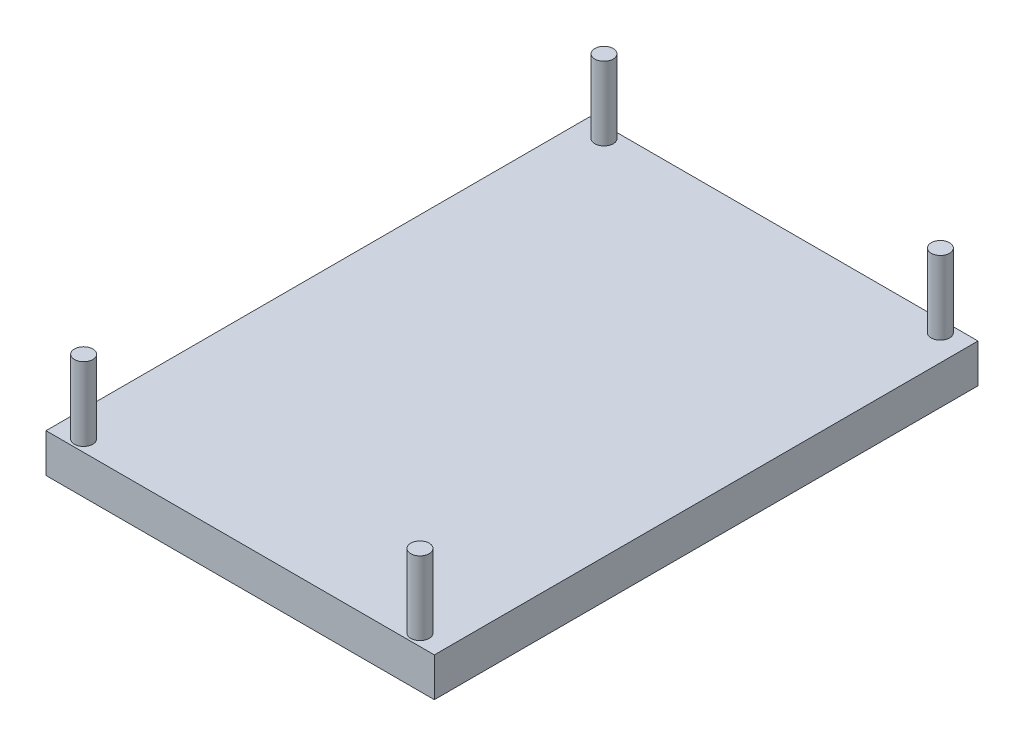
ISO-10303-21;
HEADER;
FILE_DESCRIPTION(('STEP AP214'),'2;1');
FILE_NAME('part.step','',(''),(''),'','','');
FILE_SCHEMA(('AUTOMOTIVE_DESIGN { 1 0 10303 214 1 1 1 1 }'));
ENDSEC;
DATA;
#1=APPLICATION_CONTEXT('core data for automotive mechanical design processes');
#2=APPLICATION_PROTOCOL_DEFINITION('international standard','automotive_design',2000,#1);
#3=PRODUCT_CONTEXT('',#1,'mechanical');
#4=PRODUCT('Part','Part','',(#3));
#5=PRODUCT_RELATED_PRODUCT_CATEGORY('part','',(#4));
#6=PRODUCT_DEFINITION_FORMATION('','',#4);
#7=PRODUCT_DEFINITION_CONTEXT('part definition',#1,'design');
#8=PRODUCT_DEFINITION('design','',#6,#7);
#9=PRODUCT_DEFINITION_SHAPE('','',#8);
#10=(LENGTH_UNIT() NAMED_UNIT(*) SI_UNIT(.MILLI.,.METRE.));
#11=(NAMED_UNIT(*) PLANE_ANGLE_UNIT() SI_UNIT($,.RADIAN.));
#12=(NAMED_UNIT(*) SI_UNIT($,.STERADIAN.) SOLID_ANGLE_UNIT());
#13=UNCERTAINTY_MEASURE_WITH_UNIT(LENGTH_MEASURE(1.E-05),#10,'distance_accuracy_value','');
#14=(GEOMETRIC_REPRESENTATION_CONTEXT(3) GLOBAL_UNCERTAINTY_ASSIGNED_CONTEXT((#13)) GLOBAL_UNIT_ASSIGNED_CONTEXT((#10,
#11,#12)) REPRESENTATION_CONTEXT('',''));
#15=CARTESIAN_POINT('',(0.,0.,0.));
#16=DIRECTION('',(0.,0.,1.));
#17=DIRECTION('',(1.,0.,0.));
#18=AXIS2_PLACEMENT_3D('',#15,#16,#17);
#19=CARTESIAN_POINT('',(31.75,6.35,44.45));
#20=DIRECTION('',(-1.,0.,0.));
#21=DIRECTION('',(0.,0.,1.));
#22=AXIS2_PLACEMENT_3D('',#19,#20,#21);
#23=PLANE('',#22);
#24=DIRECTION('',(0.,0.,-1.));
#25=VECTOR('',#24,1.);
#26=CARTESIAN_POINT('',(31.75,0.,44.45));
#27=LINE('',#26,#25);
#28=CARTESIAN_POINT('',(31.75,0.,44.45));
#29=VERTEX_POINT('',#28);
#30=CARTESIAN_POINT('',(31.75,0.,-44.45));
#31=VERTEX_POINT('',#30);
#32=EDGE_CURVE('E120',#29,#31,#27,.T.);
#33=ORIENTED_EDGE('',*,*,#32,.T.);
#34=DIRECTION('',(0.,-1.,0.));
#35=VECTOR('',#34,1.);
#36=CARTESIAN_POINT('',(31.75,6.35,-44.45));
#37=LINE('',#36,#35);
#38=CARTESIAN_POINT('',(31.75,6.35,-44.45));
#39=VERTEX_POINT('',#38);
#40=EDGE_CURVE('E48',#39,#31,#37,.T.);
#41=ORIENTED_EDGE('',*,*,#40,.F.);
#42=DIRECTION('',(0.,0.,-1.));
#43=VECTOR('',#42,1.);
#44=CARTESIAN_POINT('',(31.75,6.35,44.45));
#45=LINE('',#44,#43);
#46=CARTESIAN_POINT('',(31.75,6.35,44.45));
#47=VERTEX_POINT('',#46);
#48=EDGE_CURVE('E99',#47,#39,#45,.T.);
#49=ORIENTED_EDGE('',*,*,#48,.F.);
#50=DIRECTION('',(0.,-1.,0.));
#51=VECTOR('',#50,1.);
#52=CARTESIAN_POINT('',(31.75,6.35,44.45));
#53=LINE('',#52,#51);
#54=EDGE_CURVE('E114',#47,#29,#53,.T.);
#55=ORIENTED_EDGE('',*,*,#54,.T.);
#56=EDGE_LOOP('',(#33,#41,#49,#55));
#57=FACE_BOUND('',#56,.T.);
#58=ADVANCED_FACE('F44',(#57),#23,.F.);
#59=CARTESIAN_POINT('',(-31.75,6.35,-44.45));
#60=DIRECTION('',(0.,0.,1.));
#61=DIRECTION('',(1.,0.,0.));
#62=AXIS2_PLACEMENT_3D('',#59,#60,#61);
#63=PLANE('',#62);
#64=DIRECTION('',(-1.,0.,0.));
#65=VECTOR('',#64,1.);
#66=CARTESIAN_POINT('',(-31.75,0.,-44.45));
#67=LINE('',#66,#65);
#68=CARTESIAN_POINT('',(-31.75,0.,-44.45));
#69=VERTEX_POINT('',#68);
#70=EDGE_CURVE('E106',#31,#69,#67,.T.);
#71=ORIENTED_EDGE('',*,*,#70,.T.);
#72=DIRECTION('',(0.,-1.,0.));
#73=VECTOR('',#72,1.);
#74=CARTESIAN_POINT('',(-31.75,6.35,-44.45));
#75=LINE('',#74,#73);
#76=CARTESIAN_POINT('',(-31.75,6.35,-44.45));
#77=VERTEX_POINT('',#76);
#78=EDGE_CURVE('E102',#77,#69,#75,.T.);
#79=ORIENTED_EDGE('',*,*,#78,.F.);
#80=DIRECTION('',(-1.,0.,0.));
#81=VECTOR('',#80,1.);
#82=CARTESIAN_POINT('',(-31.75,6.35,-44.45));
#83=LINE('',#82,#81);
#84=EDGE_CURVE('E92',#39,#77,#83,.T.);
#85=ORIENTED_EDGE('',*,*,#84,.F.);
#86=ORIENTED_EDGE('',*,*,#40,.T.);
#87=EDGE_LOOP('',(#71,#79,#85,#86));
#88=FACE_BOUND('',#87,.T.);
#89=ADVANCED_FACE('F104',(#88),#63,.F.);
#90=CARTESIAN_POINT('',(-31.75,6.35,44.45));
#91=DIRECTION('',(1.,0.,0.));
#92=DIRECTION('',(0.,0.,-1.));
#93=AXIS2_PLACEMENT_3D('',#90,#91,#92);
#94=PLANE('',#93);
#95=DIRECTION('',(0.,0.,1.));
#96=VECTOR('',#95,1.);
#97=CARTESIAN_POINT('',(-31.75,0.,44.45));
#98=LINE('',#97,#96);
#99=CARTESIAN_POINT('',(-31.75,0.,44.45));
#100=VERTEX_POINT('',#99);
#101=EDGE_CURVE('E83',#69,#100,#98,.T.);
#102=ORIENTED_EDGE('',*,*,#101,.T.);
#103=DIRECTION('',(0.,-1.,0.));
#104=VECTOR('',#103,1.);
#105=CARTESIAN_POINT('',(-31.75,6.35,44.45));
#106=LINE('',#105,#104);
#107=CARTESIAN_POINT('',(-31.75,6.35,44.45));
#108=VERTEX_POINT('',#107);
#109=EDGE_CURVE('E107',#108,#100,#106,.T.);
#110=ORIENTED_EDGE('',*,*,#109,.F.);
#111=DIRECTION('',(0.,0.,1.));
#112=VECTOR('',#111,1.);
#113=CARTESIAN_POINT('',(-31.75,6.35,44.45));
#114=LINE('',#113,#112);
#115=EDGE_CURVE('E98',#77,#108,#114,.T.);
#116=ORIENTED_EDGE('',*,*,#115,.F.);
#117=ORIENTED_EDGE('',*,*,#78,.T.);
#118=EDGE_LOOP('',(#102,#110,#116,#117));
#119=FACE_BOUND('',#118,.T.);
#120=ADVANCED_FACE('F108',(#119),#94,.F.);
#121=CARTESIAN_POINT('',(-31.75,6.35,44.45));
#122=DIRECTION('',(0.,0.,-1.));
#123=DIRECTION('',(-1.,0.,0.));
#124=AXIS2_PLACEMENT_3D('',#121,#122,#123);
#125=PLANE('',#124);
#126=DIRECTION('',(1.,0.,0.));
#127=VECTOR('',#126,1.);
#128=CARTESIAN_POINT('',(-31.75,0.,44.45));
#129=LINE('',#128,#127);
#130=EDGE_CURVE('E87',#100,#29,#129,.T.);
#131=ORIENTED_EDGE('',*,*,#130,.T.);
#132=ORIENTED_EDGE('',*,*,#54,.F.);
#133=DIRECTION('',(1.,0.,0.));
#134=VECTOR('',#133,1.);
#135=CARTESIAN_POINT('',(-31.75,6.35,44.45));
#136=LINE('',#135,#134);
#137=EDGE_CURVE('E61',#108,#47,#136,.T.);
#138=ORIENTED_EDGE('',*,*,#137,.F.);
#139=ORIENTED_EDGE('',*,*,#109,.T.);
#140=EDGE_LOOP('',(#131,#132,#138,#139));
#141=FACE_BOUND('',#140,.T.);
#142=ADVANCED_FACE('F132',(#141),#125,.F.);
#143=CARTESIAN_POINT('',(0.,6.35,0.));
#144=DIRECTION('',(0.,-1.,0.));
#145=DIRECTION('',(0.,0.,-1.));
#146=AXIS2_PLACEMENT_3D('',#143,#144,#145);
#147=PLANE('',#146);
#148=CARTESIAN_POINT('',(-27.5,6.35,42.5476668383201));
#149=DIRECTION('',(0.,1.,0.));
#150=DIRECTION('',(0.,0.,1.));
#151=AXIS2_PLACEMENT_3D('',#148,#149,#150);
#152=CIRCLE('',#151,1.5);
#153=CARTESIAN_POINT('',(-27.5,6.35,44.0476668383201));
#154=VERTEX_POINT('',#153);
#155=EDGE_CURVE('E11',#154,#154,#152,.T.);
#156=ORIENTED_EDGE('',*,*,#155,.F.);
#157=EDGE_LOOP('',(#156));
#158=FACE_BOUND('',#157,.T.);
#159=CARTESIAN_POINT('',(27.5,6.35,42.5476668383201));
#160=DIRECTION('',(0.,1.,0.));
#161=DIRECTION('',(0.,0.,1.));
#162=AXIS2_PLACEMENT_3D('',#159,#160,#161);
#163=CIRCLE('',#162,1.5);
#164=CARTESIAN_POINT('',(27.5,6.35,44.0476668383201));
#165=VERTEX_POINT('',#164);
#166=EDGE_CURVE('E54',#165,#165,#163,.T.);
#167=ORIENTED_EDGE('',*,*,#166,.F.);
#168=EDGE_LOOP('',(#167));
#169=FACE_BOUND('',#168,.T.);
#170=CARTESIAN_POINT('',(27.5,6.35,-42.5476668383201));
#171=DIRECTION('',(0.,1.,0.));
#172=DIRECTION('',(0.,0.,1.));
#173=AXIS2_PLACEMENT_3D('',#170,#171,#172);
#174=CIRCLE('',#173,1.5);
#175=CARTESIAN_POINT('',(27.5,6.35,-41.0476668383201));
#176=VERTEX_POINT('',#175);
#177=EDGE_CURVE('E142',#176,#176,#174,.T.);
#178=ORIENTED_EDGE('',*,*,#177,.F.);
#179=EDGE_LOOP('',(#178));
#180=FACE_BOUND('',#179,.T.);
#181=CARTESIAN_POINT('',(-27.5,6.35,-42.5476668383201));
#182=DIRECTION('',(0.,1.,0.));
#183=DIRECTION('',(0.,0.,1.));
#184=AXIS2_PLACEMENT_3D('',#181,#182,#183);
#185=CIRCLE('',#184,1.5);
#186=CARTESIAN_POINT('',(-27.5,6.35,-41.0476668383201));
#187=VERTEX_POINT('',#186);
#188=EDGE_CURVE('E137',#187,#187,#185,.T.);
#189=ORIENTED_EDGE('',*,*,#188,.F.);
#190=EDGE_LOOP('',(#189));
#191=FACE_BOUND('',#190,.T.);
#192=ORIENTED_EDGE('',*,*,#48,.T.);
#193=ORIENTED_EDGE('',*,*,#84,.T.);
#194=ORIENTED_EDGE('',*,*,#115,.T.);
#195=ORIENTED_EDGE('',*,*,#137,.T.);
#196=EDGE_LOOP('',(#192,#193,#194,#195));
#197=FACE_BOUND('',#196,.T.);
#198=ADVANCED_FACE('F96',(#158,#169,#180,#191,#197),#147,.F.);
#199=CARTESIAN_POINT('',(0.,0.,0.));
#200=DIRECTION('',(0.,-1.,0.));
#201=DIRECTION('',(0.,0.,-1.));
#202=AXIS2_PLACEMENT_3D('',#199,#200,#201);
#203=PLANE('',#202);
#204=ORIENTED_EDGE('',*,*,#32,.F.);
#205=ORIENTED_EDGE('',*,*,#130,.F.);
#206=ORIENTED_EDGE('',*,*,#101,.F.);
#207=ORIENTED_EDGE('',*,*,#70,.F.);
#208=EDGE_LOOP('',(#204,#205,#206,#207));
#209=FACE_BOUND('',#208,.T.);
#210=ADVANCED_FACE('F131',(#209),#203,.T.);
#211=CARTESIAN_POINT('',(-27.5,18.35,-42.5476668383201));
#212=DIRECTION('',(0.,-1.,0.));
#213=DIRECTION('',(0.,0.,-1.));
#214=AXIS2_PLACEMENT_3D('',#211,#212,#213);
#215=CYLINDRICAL_SURFACE('',#214,1.5);
#216=CARTESIAN_POINT('',(-27.5,18.35,-42.5476668383201));
#217=DIRECTION('',(0.,1.,0.));
#218=DIRECTION('',(0.,0.,1.));
#219=AXIS2_PLACEMENT_3D('',#216,#217,#218);
#220=CIRCLE('',#219,1.5);
#221=CARTESIAN_POINT('',(-27.5,18.35,-41.0476668383201));
#222=VERTEX_POINT('',#221);
#223=EDGE_CURVE('E123',#222,#222,#220,.T.);
#224=ORIENTED_EDGE('',*,*,#223,.F.);
#225=EDGE_LOOP('',(#224));
#226=FACE_BOUND('',#225,.T.);
#227=ORIENTED_EDGE('',*,*,#188,.T.);
#228=EDGE_LOOP('',(#227));
#229=FACE_BOUND('',#228,.T.);
#230=ADVANCED_FACE('F174',(#226,#229),#215,.T.);
#231=CARTESIAN_POINT('',(-27.5,18.35,-42.5476668383201));
#232=DIRECTION('',(0.,1.,0.));
#233=DIRECTION('',(0.,0.,1.));
#234=AXIS2_PLACEMENT_3D('',#231,#232,#233);
#235=PLANE('',#234);
#236=ORIENTED_EDGE('',*,*,#223,.T.);
#237=EDGE_LOOP('',(#236));
#238=FACE_BOUND('',#237,.T.);
#239=ADVANCED_FACE('F173',(#238),#235,.T.);
#240=CARTESIAN_POINT('',(27.5,18.35,-42.5476668383201));
#241=DIRECTION('',(0.,-1.,0.));
#242=DIRECTION('',(0.,0.,-1.));
#243=AXIS2_PLACEMENT_3D('',#240,#241,#242);
#244=CYLINDRICAL_SURFACE('',#243,1.5);
#245=CARTESIAN_POINT('',(27.5,18.35,-42.5476668383201));
#246=DIRECTION('',(0.,1.,0.));
#247=DIRECTION('',(0.,0.,1.));
#248=AXIS2_PLACEMENT_3D('',#245,#246,#247);
#249=CIRCLE('',#248,1.5);
#250=CARTESIAN_POINT('',(27.5,18.35,-41.0476668383201));
#251=VERTEX_POINT('',#250);
#252=EDGE_CURVE('E148',#251,#251,#249,.T.);
#253=ORIENTED_EDGE('',*,*,#252,.F.);
#254=EDGE_LOOP('',(#253));
#255=FACE_BOUND('',#254,.T.);
#256=ORIENTED_EDGE('',*,*,#177,.T.);
#257=EDGE_LOOP('',(#256));
#258=FACE_BOUND('',#257,.T.);
#259=ADVANCED_FACE('F164',(#255,#258),#244,.T.);
#260=CARTESIAN_POINT('',(27.5,18.35,-42.5476668383201));
#261=DIRECTION('',(0.,1.,0.));
#262=DIRECTION('',(0.,0.,1.));
#263=AXIS2_PLACEMENT_3D('',#260,#261,#262);
#264=PLANE('',#263);
#265=ORIENTED_EDGE('',*,*,#252,.T.);
#266=EDGE_LOOP('',(#265));
#267=FACE_BOUND('',#266,.T.);
#268=ADVANCED_FACE('F233',(#267),#264,.T.);
#269=CARTESIAN_POINT('',(27.5,18.35,42.5476668383201));
#270=DIRECTION('',(0.,-1.,0.));
#271=DIRECTION('',(0.,0.,-1.));
#272=AXIS2_PLACEMENT_3D('',#269,#270,#271);
#273=CYLINDRICAL_SURFACE('',#272,1.5);
#274=CARTESIAN_POINT('',(27.5,18.35,42.5476668383201));
#275=DIRECTION('',(0.,1.,0.));
#276=DIRECTION('',(0.,0.,1.));
#277=AXIS2_PLACEMENT_3D('',#274,#275,#276);
#278=CIRCLE('',#277,1.5);
#279=CARTESIAN_POINT('',(27.5,18.35,44.0476668383201));
#280=VERTEX_POINT('',#279);
#281=EDGE_CURVE('E147',#280,#280,#278,.T.);
#282=ORIENTED_EDGE('',*,*,#281,.F.);
#283=EDGE_LOOP('',(#282));
#284=FACE_BOUND('',#283,.T.);
#285=ORIENTED_EDGE('',*,*,#166,.T.);
#286=EDGE_LOOP('',(#285));
#287=FACE_BOUND('',#286,.T.);
#288=ADVANCED_FACE('F238',(#284,#287),#273,.T.);
#289=CARTESIAN_POINT('',(27.5,18.35,42.5476668383201));
#290=DIRECTION('',(0.,1.,0.));
#291=DIRECTION('',(0.,0.,1.));
#292=AXIS2_PLACEMENT_3D('',#289,#290,#291);
#293=PLANE('',#292);
#294=ORIENTED_EDGE('',*,*,#281,.T.);
#295=EDGE_LOOP('',(#294));
#296=FACE_BOUND('',#295,.T.);
#297=ADVANCED_FACE('F250',(#296),#293,.T.);
#298=CARTESIAN_POINT('',(-27.5,18.35,42.5476668383201));
#299=DIRECTION('',(0.,-1.,0.));
#300=DIRECTION('',(0.,0.,-1.));
#301=AXIS2_PLACEMENT_3D('',#298,#299,#300);
#302=CYLINDRICAL_SURFACE('',#301,1.5);
#303=CARTESIAN_POINT('',(-27.5,18.35,42.5476668383201));
#304=DIRECTION('',(0.,1.,0.));
#305=DIRECTION('',(0.,0.,1.));
#306=AXIS2_PLACEMENT_3D('',#303,#304,#305);
#307=CIRCLE('',#306,1.5);
#308=CARTESIAN_POINT('',(-27.5,18.35,44.0476668383201));
#309=VERTEX_POINT('',#308);
#310=EDGE_CURVE('E150',#309,#309,#307,.T.);
#311=ORIENTED_EDGE('',*,*,#310,.F.);
#312=EDGE_LOOP('',(#311));
#313=FACE_BOUND('',#312,.T.);
#314=ORIENTED_EDGE('',*,*,#155,.T.);
#315=EDGE_LOOP('',(#314));
#316=FACE_BOUND('',#315,.T.);
#317=ADVANCED_FACE('F256',(#313,#316),#302,.T.);
#318=CARTESIAN_POINT('',(-27.5,18.35,42.5476668383201));
#319=DIRECTION('',(0.,1.,0.));
#320=DIRECTION('',(0.,0.,1.));
#321=AXIS2_PLACEMENT_3D('',#318,#319,#320);
#322=PLANE('',#321);
#323=ORIENTED_EDGE('',*,*,#310,.T.);
#324=EDGE_LOOP('',(#323));
#325=FACE_BOUND('',#324,.T.);
#326=ADVANCED_FACE('F270',(#325),#322,.T.);
#327=CLOSED_SHELL('',(#58,#89,#120,#142,#198,#210,#230,#239,#259,#268,#288,#297,#317,#326));
#328=MANIFOLD_SOLID_BREP('B2',#327);
#329=ADVANCED_BREP_SHAPE_REPRESENTATION('',(#18,#328),#14);
#330=SHAPE_DEFINITION_REPRESENTATION(#9,#329);
ENDSEC;
END-ISO-10303-21;
